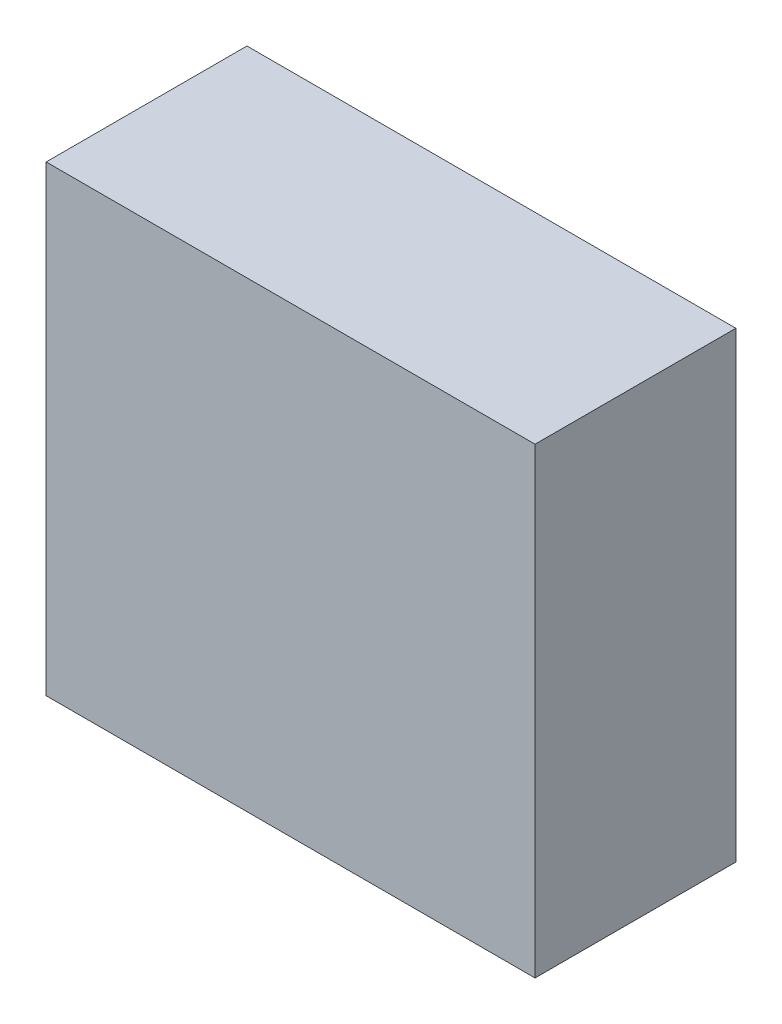
ISO-10303-21;
HEADER;
FILE_DESCRIPTION(('STEP AP214'),'2;1');
FILE_NAME('part.step','',(''),(''),'','','');
FILE_SCHEMA(('AUTOMOTIVE_DESIGN { 1 0 10303 214 1 1 1 1 }'));
ENDSEC;
DATA;
#1=APPLICATION_CONTEXT('core data for automotive mechanical design processes');
#2=APPLICATION_PROTOCOL_DEFINITION('international standard','automotive_design',2000,#1);
#3=PRODUCT_CONTEXT('',#1,'mechanical');
#4=PRODUCT('Part','Part','',(#3));
#5=PRODUCT_RELATED_PRODUCT_CATEGORY('part','',(#4));
#6=PRODUCT_DEFINITION_FORMATION('','',#4);
#7=PRODUCT_DEFINITION_CONTEXT('part definition',#1,'design');
#8=PRODUCT_DEFINITION('design','',#6,#7);
#9=PRODUCT_DEFINITION_SHAPE('','',#8);
#10=(LENGTH_UNIT() NAMED_UNIT(*) SI_UNIT(.MILLI.,.METRE.));
#11=(NAMED_UNIT(*) PLANE_ANGLE_UNIT() SI_UNIT($,.RADIAN.));
#12=(NAMED_UNIT(*) SI_UNIT($,.STERADIAN.) SOLID_ANGLE_UNIT());
#13=UNCERTAINTY_MEASURE_WITH_UNIT(LENGTH_MEASURE(1.E-05),#10,'distance_accuracy_value','');
#14=(GEOMETRIC_REPRESENTATION_CONTEXT(3) GLOBAL_UNCERTAINTY_ASSIGNED_CONTEXT((#13)) GLOBAL_UNIT_ASSIGNED_CONTEXT((#10,
#11,#12)) REPRESENTATION_CONTEXT('',''));
#15=CARTESIAN_POINT('',(0.,0.,0.));
#16=DIRECTION('',(0.,0.,1.));
#17=DIRECTION('',(1.,0.,0.));
#18=AXIS2_PLACEMENT_3D('',#15,#16,#17);
#19=CARTESIAN_POINT('',(21.425,-20.26,17.6));
#20=DIRECTION('',(-1.,0.,0.));
#21=DIRECTION('',(0.,0.,1.));
#22=AXIS2_PLACEMENT_3D('',#19,#20,#21);
#23=PLANE('',#22);
#24=DIRECTION('',(0.,1.,0.));
#25=VECTOR('',#24,1.);
#26=CARTESIAN_POINT('',(21.425,-20.26,0.));
#27=LINE('',#26,#25);
#28=CARTESIAN_POINT('',(21.425,-20.26,0.));
#29=VERTEX_POINT('',#28);
#30=CARTESIAN_POINT('',(21.425,20.26,0.));
#31=VERTEX_POINT('',#30);
#32=EDGE_CURVE('E102',#29,#31,#27,.T.);
#33=ORIENTED_EDGE('',*,*,#32,.T.);
#34=DIRECTION('',(0.,0.,-1.));
#35=VECTOR('',#34,1.);
#36=CARTESIAN_POINT('',(21.425,20.26,17.6));
#37=LINE('',#36,#35);
#38=CARTESIAN_POINT('',(21.425,20.26,17.6));
#39=VERTEX_POINT('',#38);
#40=EDGE_CURVE('E11',#39,#31,#37,.T.);
#41=ORIENTED_EDGE('',*,*,#40,.F.);
#42=DIRECTION('',(0.,1.,0.));
#43=VECTOR('',#42,1.);
#44=CARTESIAN_POINT('',(21.425,-20.26,17.6));
#45=LINE('',#44,#43);
#46=CARTESIAN_POINT('',(21.425,-20.26,17.6));
#47=VERTEX_POINT('',#46);
#48=EDGE_CURVE('E90',#47,#39,#45,.T.);
#49=ORIENTED_EDGE('',*,*,#48,.F.);
#50=DIRECTION('',(0.,0.,-1.));
#51=VECTOR('',#50,1.);
#52=CARTESIAN_POINT('',(21.425,-20.26,17.6));
#53=LINE('',#52,#51);
#54=EDGE_CURVE('E98',#47,#29,#53,.T.);
#55=ORIENTED_EDGE('',*,*,#54,.T.);
#56=EDGE_LOOP('',(#33,#41,#49,#55));
#57=FACE_BOUND('',#56,.T.);
#58=ADVANCED_FACE('F39',(#57),#23,.F.);
#59=CARTESIAN_POINT('',(-21.425,20.26,17.6));
#60=DIRECTION('',(0.,-1.,0.));
#61=DIRECTION('',(0.,0.,-1.));
#62=AXIS2_PLACEMENT_3D('',#59,#60,#61);
#63=PLANE('',#62);
#64=DIRECTION('',(-1.,0.,0.));
#65=VECTOR('',#64,1.);
#66=CARTESIAN_POINT('',(-21.425,20.26,0.));
#67=LINE('',#66,#65);
#68=CARTESIAN_POINT('',(-21.425,20.26,0.));
#69=VERTEX_POINT('',#68);
#70=EDGE_CURVE('E94',#31,#69,#67,.T.);
#71=ORIENTED_EDGE('',*,*,#70,.T.);
#72=DIRECTION('',(0.,0.,-1.));
#73=VECTOR('',#72,1.);
#74=CARTESIAN_POINT('',(-21.425,20.26,17.6));
#75=LINE('',#74,#73);
#76=CARTESIAN_POINT('',(-21.425,20.26,17.6));
#77=VERTEX_POINT('',#76);
#78=EDGE_CURVE('E47',#77,#69,#75,.T.);
#79=ORIENTED_EDGE('',*,*,#78,.F.);
#80=DIRECTION('',(-1.,0.,0.));
#81=VECTOR('',#80,1.);
#82=CARTESIAN_POINT('',(-21.425,20.26,17.6));
#83=LINE('',#82,#81);
#84=EDGE_CURVE('E85',#39,#77,#83,.T.);
#85=ORIENTED_EDGE('',*,*,#84,.F.);
#86=ORIENTED_EDGE('',*,*,#40,.T.);
#87=EDGE_LOOP('',(#71,#79,#85,#86));
#88=FACE_BOUND('',#87,.T.);
#89=ADVANCED_FACE('F93',(#88),#63,.F.);
#90=CARTESIAN_POINT('',(-21.425,-20.26,17.6));
#91=DIRECTION('',(1.,0.,0.));
#92=DIRECTION('',(0.,0.,-1.));
#93=AXIS2_PLACEMENT_3D('',#90,#91,#92);
#94=PLANE('',#93);
#95=DIRECTION('',(0.,-1.,0.));
#96=VECTOR('',#95,1.);
#97=CARTESIAN_POINT('',(-21.425,-20.26,0.));
#98=LINE('',#97,#96);
#99=CARTESIAN_POINT('',(-21.425,-20.26,0.));
#100=VERTEX_POINT('',#99);
#101=EDGE_CURVE('E72',#69,#100,#98,.T.);
#102=ORIENTED_EDGE('',*,*,#101,.T.);
#103=DIRECTION('',(0.,0.,-1.));
#104=VECTOR('',#103,1.);
#105=CARTESIAN_POINT('',(-21.425,-20.26,17.6));
#106=LINE('',#105,#104);
#107=CARTESIAN_POINT('',(-21.425,-20.26,17.6));
#108=VERTEX_POINT('',#107);
#109=EDGE_CURVE('E95',#108,#100,#106,.T.);
#110=ORIENTED_EDGE('',*,*,#109,.F.);
#111=DIRECTION('',(0.,-1.,0.));
#112=VECTOR('',#111,1.);
#113=CARTESIAN_POINT('',(-21.425,-20.26,17.6));
#114=LINE('',#113,#112);
#115=EDGE_CURVE('E88',#77,#108,#114,.T.);
#116=ORIENTED_EDGE('',*,*,#115,.F.);
#117=ORIENTED_EDGE('',*,*,#78,.T.);
#118=EDGE_LOOP('',(#102,#110,#116,#117));
#119=FACE_BOUND('',#118,.T.);
#120=ADVANCED_FACE('F96',(#119),#94,.F.);
#121=CARTESIAN_POINT('',(-21.425,-20.26,17.6));
#122=DIRECTION('',(0.,1.,0.));
#123=DIRECTION('',(0.,0.,1.));
#124=AXIS2_PLACEMENT_3D('',#121,#122,#123);
#125=PLANE('',#124);
#126=DIRECTION('',(1.,0.,0.));
#127=VECTOR('',#126,1.);
#128=CARTESIAN_POINT('',(-21.425,-20.26,0.));
#129=LINE('',#128,#127);
#130=EDGE_CURVE('E78',#100,#29,#129,.T.);
#131=ORIENTED_EDGE('',*,*,#130,.T.);
#132=ORIENTED_EDGE('',*,*,#54,.F.);
#133=DIRECTION('',(1.,0.,0.));
#134=VECTOR('',#133,1.);
#135=CARTESIAN_POINT('',(-21.425,-20.26,17.6));
#136=LINE('',#135,#134);
#137=EDGE_CURVE('E55',#108,#47,#136,.T.);
#138=ORIENTED_EDGE('',*,*,#137,.F.);
#139=ORIENTED_EDGE('',*,*,#109,.T.);
#140=EDGE_LOOP('',(#131,#132,#138,#139));
#141=FACE_BOUND('',#140,.T.);
#142=ADVANCED_FACE('F109',(#141),#125,.F.);
#143=CARTESIAN_POINT('',(0.,0.,17.6));
#144=DIRECTION('',(0.,0.,-1.));
#145=DIRECTION('',(-1.,0.,0.));
#146=AXIS2_PLACEMENT_3D('',#143,#144,#145);
#147=PLANE('',#146);
#148=ORIENTED_EDGE('',*,*,#48,.T.);
#149=ORIENTED_EDGE('',*,*,#84,.T.);
#150=ORIENTED_EDGE('',*,*,#115,.T.);
#151=ORIENTED_EDGE('',*,*,#137,.T.);
#152=EDGE_LOOP('',(#148,#149,#150,#151));
#153=FACE_BOUND('',#152,.T.);
#154=ADVANCED_FACE('F86',(#153),#147,.F.);
#155=CARTESIAN_POINT('',(0.,0.,0.));
#156=DIRECTION('',(0.,0.,-1.));
#157=DIRECTION('',(-1.,0.,0.));
#158=AXIS2_PLACEMENT_3D('',#155,#156,#157);
#159=PLANE('',#158);
#160=ORIENTED_EDGE('',*,*,#32,.F.);
#161=ORIENTED_EDGE('',*,*,#130,.F.);
#162=ORIENTED_EDGE('',*,*,#101,.F.);
#163=ORIENTED_EDGE('',*,*,#70,.F.);
#164=EDGE_LOOP('',(#160,#161,#162,#163));
#165=FACE_BOUND('',#164,.T.);
#166=ADVANCED_FACE('F112',(#165),#159,.T.);
#167=CLOSED_SHELL('',(#58,#89,#120,#142,#154,#166));
#168=MANIFOLD_SOLID_BREP('B2',#167);
#169=ADVANCED_BREP_SHAPE_REPRESENTATION('',(#18,#168),#14);
#170=SHAPE_DEFINITION_REPRESENTATION(#9,#169);
ENDSEC;
END-ISO-10303-21;
